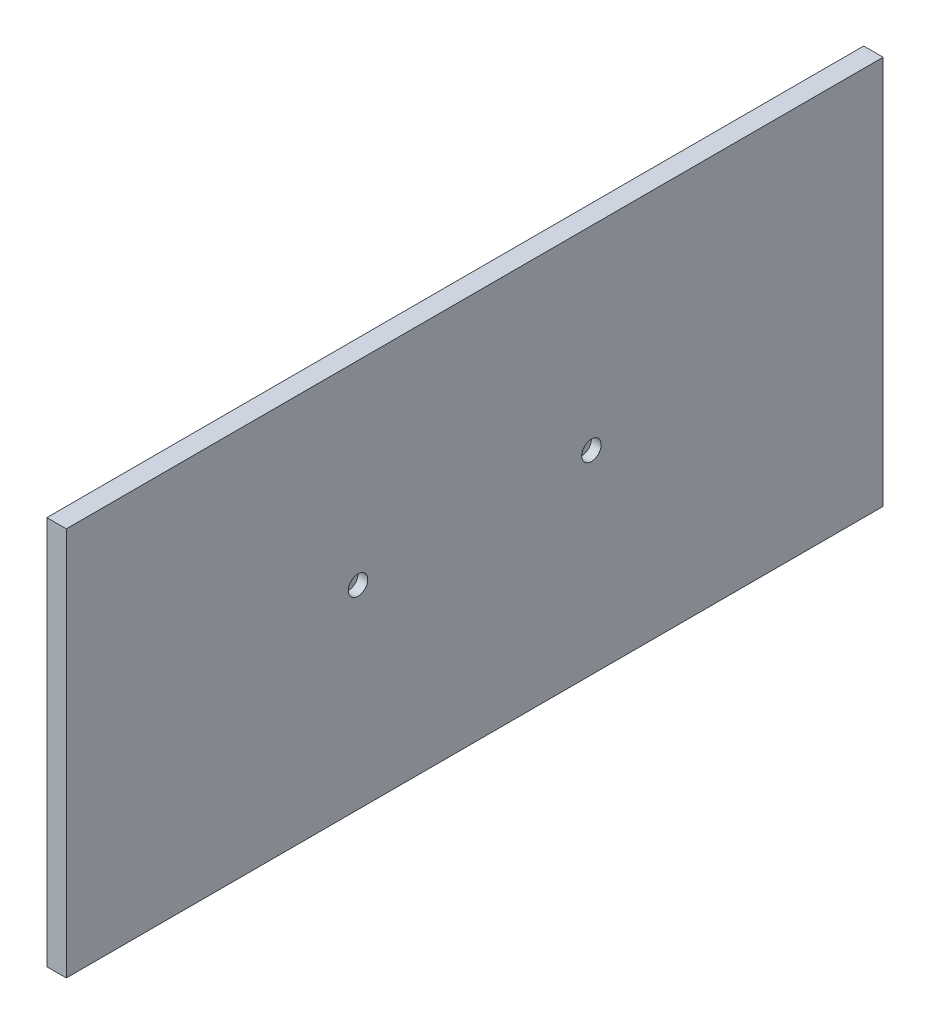
ISO-10303-21;
HEADER;
FILE_DESCRIPTION(('STEP AP214'),'2;1');
FILE_NAME('part.step','',(''),(''),'','','');
FILE_SCHEMA(('AUTOMOTIVE_DESIGN { 1 0 10303 214 1 1 1 1 }'));
ENDSEC;
DATA;
#1=APPLICATION_CONTEXT('core data for automotive mechanical design processes');
#2=APPLICATION_PROTOCOL_DEFINITION('international standard','automotive_design',2000,#1);
#3=PRODUCT_CONTEXT('',#1,'mechanical');
#4=PRODUCT('Part','Part','',(#3));
#5=PRODUCT_RELATED_PRODUCT_CATEGORY('part','',(#4));
#6=PRODUCT_DEFINITION_FORMATION('','',#4);
#7=PRODUCT_DEFINITION_CONTEXT('part definition',#1,'design');
#8=PRODUCT_DEFINITION('design','',#6,#7);
#9=PRODUCT_DEFINITION_SHAPE('','',#8);
#10=(LENGTH_UNIT() NAMED_UNIT(*) SI_UNIT(.MILLI.,.METRE.));
#11=(NAMED_UNIT(*) PLANE_ANGLE_UNIT() SI_UNIT($,.RADIAN.));
#12=(NAMED_UNIT(*) SI_UNIT($,.STERADIAN.) SOLID_ANGLE_UNIT());
#13=UNCERTAINTY_MEASURE_WITH_UNIT(LENGTH_MEASURE(1.E-05),#10,'distance_accuracy_value','');
#14=(GEOMETRIC_REPRESENTATION_CONTEXT(3) GLOBAL_UNCERTAINTY_ASSIGNED_CONTEXT((#13)) GLOBAL_UNIT_ASSIGNED_CONTEXT((#10,
#11,#12)) REPRESENTATION_CONTEXT('',''));
#15=CARTESIAN_POINT('',(0.,0.,0.));
#16=DIRECTION('',(0.,0.,1.));
#17=DIRECTION('',(1.,0.,0.));
#18=AXIS2_PLACEMENT_3D('',#15,#16,#17);
#19=CARTESIAN_POINT('',(10.,0.,0.));
#20=DIRECTION('',(0.,0.,-1.));
#21=DIRECTION('',(-1.,0.,0.));
#22=AXIS2_PLACEMENT_3D('',#19,#20,#21);
#23=PLANE('',#22);
#24=DIRECTION('',(0.,-1.,0.));
#25=VECTOR('',#24,1.);
#26=CARTESIAN_POINT('',(0.,0.,0.));
#27=LINE('',#26,#25);
#28=CARTESIAN_POINT('',(0.,200.,0.));
#29=VERTEX_POINT('',#28);
#30=CARTESIAN_POINT('',(0.,0.,0.));
#31=VERTEX_POINT('',#30);
#32=EDGE_CURVE('E98',#29,#31,#27,.T.);
#33=ORIENTED_EDGE('',*,*,#32,.T.);
#34=DIRECTION('',(-1.,0.,0.));
#35=VECTOR('',#34,1.);
#36=CARTESIAN_POINT('',(10.,0.,0.));
#37=LINE('',#36,#35);
#38=CARTESIAN_POINT('',(10.,0.,0.));
#39=VERTEX_POINT('',#38);
#40=EDGE_CURVE('E11',#39,#31,#37,.T.);
#41=ORIENTED_EDGE('',*,*,#40,.F.);
#42=DIRECTION('',(0.,-1.,0.));
#43=VECTOR('',#42,1.);
#44=CARTESIAN_POINT('',(10.,0.,0.));
#45=LINE('',#44,#43);
#46=CARTESIAN_POINT('',(10.,200.,0.));
#47=VERTEX_POINT('',#46);
#48=EDGE_CURVE('E86',#47,#39,#45,.T.);
#49=ORIENTED_EDGE('',*,*,#48,.F.);
#50=DIRECTION('',(-1.,0.,0.));
#51=VECTOR('',#50,1.);
#52=CARTESIAN_POINT('',(10.,200.,0.));
#53=LINE('',#52,#51);
#54=EDGE_CURVE('E94',#47,#29,#53,.T.);
#55=ORIENTED_EDGE('',*,*,#54,.T.);
#56=EDGE_LOOP('',(#33,#41,#49,#55));
#57=FACE_BOUND('',#56,.T.);
#58=ADVANCED_FACE('F35',(#57),#23,.F.);
#59=CARTESIAN_POINT('',(10.,0.,0.));
#60=DIRECTION('',(0.,1.,0.));
#61=DIRECTION('',(0.,0.,1.));
#62=AXIS2_PLACEMENT_3D('',#59,#60,#61);
#63=PLANE('',#62);
#64=DIRECTION('',(0.,0.,-1.));
#65=VECTOR('',#64,1.);
#66=CARTESIAN_POINT('',(0.,0.,0.));
#67=LINE('',#66,#65);
#68=CARTESIAN_POINT('',(0.,0.,-420.));
#69=VERTEX_POINT('',#68);
#70=EDGE_CURVE('E90',#31,#69,#67,.T.);
#71=ORIENTED_EDGE('',*,*,#70,.T.);
#72=DIRECTION('',(-1.,0.,0.));
#73=VECTOR('',#72,1.);
#74=CARTESIAN_POINT('',(10.,0.,-420.));
#75=LINE('',#74,#73);
#76=CARTESIAN_POINT('',(10.,0.,-420.));
#77=VERTEX_POINT('',#76);
#78=EDGE_CURVE('E43',#77,#69,#75,.T.);
#79=ORIENTED_EDGE('',*,*,#78,.F.);
#80=DIRECTION('',(0.,0.,-1.));
#81=VECTOR('',#80,1.);
#82=CARTESIAN_POINT('',(10.,0.,0.));
#83=LINE('',#82,#81);
#84=EDGE_CURVE('E81',#39,#77,#83,.T.);
#85=ORIENTED_EDGE('',*,*,#84,.F.);
#86=ORIENTED_EDGE('',*,*,#40,.T.);
#87=EDGE_LOOP('',(#71,#79,#85,#86));
#88=FACE_BOUND('',#87,.T.);
#89=ADVANCED_FACE('F89',(#88),#63,.F.);
#90=CARTESIAN_POINT('',(10.,0.,-420.));
#91=DIRECTION('',(0.,0.,1.));
#92=DIRECTION('',(1.,0.,0.));
#93=AXIS2_PLACEMENT_3D('',#90,#91,#92);
#94=PLANE('',#93);
#95=DIRECTION('',(0.,1.,0.));
#96=VECTOR('',#95,1.);
#97=CARTESIAN_POINT('',(0.,0.,-420.));
#98=LINE('',#97,#96);
#99=CARTESIAN_POINT('',(0.,200.,-420.));
#100=VERTEX_POINT('',#99);
#101=EDGE_CURVE('E68',#69,#100,#98,.T.);
#102=ORIENTED_EDGE('',*,*,#101,.T.);
#103=DIRECTION('',(-1.,0.,0.));
#104=VECTOR('',#103,1.);
#105=CARTESIAN_POINT('',(10.,200.,-420.));
#106=LINE('',#105,#104);
#107=CARTESIAN_POINT('',(10.,200.,-420.));
#108=VERTEX_POINT('',#107);
#109=EDGE_CURVE('E91',#108,#100,#106,.T.);
#110=ORIENTED_EDGE('',*,*,#109,.F.);
#111=DIRECTION('',(0.,1.,0.));
#112=VECTOR('',#111,1.);
#113=CARTESIAN_POINT('',(10.,0.,-420.));
#114=LINE('',#113,#112);
#115=EDGE_CURVE('E84',#77,#108,#114,.T.);
#116=ORIENTED_EDGE('',*,*,#115,.F.);
#117=ORIENTED_EDGE('',*,*,#78,.T.);
#118=EDGE_LOOP('',(#102,#110,#116,#117));
#119=FACE_BOUND('',#118,.T.);
#120=ADVANCED_FACE('F92',(#119),#94,.F.);
#121=CARTESIAN_POINT('',(10.,200.,0.));
#122=DIRECTION('',(0.,-1.,0.));
#123=DIRECTION('',(0.,0.,-1.));
#124=AXIS2_PLACEMENT_3D('',#121,#122,#123);
#125=PLANE('',#124);
#126=DIRECTION('',(0.,0.,1.));
#127=VECTOR('',#126,1.);
#128=CARTESIAN_POINT('',(0.,200.,0.));
#129=LINE('',#128,#127);
#130=EDGE_CURVE('E74',#100,#29,#129,.T.);
#131=ORIENTED_EDGE('',*,*,#130,.T.);
#132=ORIENTED_EDGE('',*,*,#54,.F.);
#133=DIRECTION('',(0.,0.,1.));
#134=VECTOR('',#133,1.);
#135=CARTESIAN_POINT('',(10.,200.,0.));
#136=LINE('',#135,#134);
#137=EDGE_CURVE('E51',#108,#47,#136,.T.);
#138=ORIENTED_EDGE('',*,*,#137,.F.);
#139=ORIENTED_EDGE('',*,*,#109,.T.);
#140=EDGE_LOOP('',(#131,#132,#138,#139));
#141=FACE_BOUND('',#140,.T.);
#142=ADVANCED_FACE('F106',(#141),#125,.F.);
#143=CARTESIAN_POINT('',(10.,0.,0.));
#144=DIRECTION('',(-1.,0.,0.));
#145=DIRECTION('',(0.,0.,1.));
#146=AXIS2_PLACEMENT_3D('',#143,#144,#145);
#147=PLANE('',#146);
#148=CARTESIAN_POINT('',(10.,100.,-270.));
#149=DIRECTION('',(1.,0.,0.));
#150=DIRECTION('',(0.,0.,-1.));
#151=AXIS2_PLACEMENT_3D('',#148,#149,#150);
#152=CIRCLE('',#151,4.99999999999999);
#153=CARTESIAN_POINT('',(10.,100.,-275.));
#154=VERTEX_POINT('',#153);
#155=EDGE_CURVE('E118',#154,#154,#152,.T.);
#156=ORIENTED_EDGE('',*,*,#155,.F.);
#157=EDGE_LOOP('',(#156));
#158=FACE_BOUND('',#157,.T.);
#159=CARTESIAN_POINT('',(10.,100.,-150.));
#160=DIRECTION('',(1.,0.,0.));
#161=DIRECTION('',(0.,0.,-1.));
#162=AXIS2_PLACEMENT_3D('',#159,#160,#161);
#163=CIRCLE('',#162,5.00000000000002);
#164=CARTESIAN_POINT('',(10.,100.,-155.));
#165=VERTEX_POINT('',#164);
#166=EDGE_CURVE('E112',#165,#165,#163,.T.);
#167=ORIENTED_EDGE('',*,*,#166,.F.);
#168=EDGE_LOOP('',(#167));
#169=FACE_BOUND('',#168,.T.);
#170=ORIENTED_EDGE('',*,*,#48,.T.);
#171=ORIENTED_EDGE('',*,*,#84,.T.);
#172=ORIENTED_EDGE('',*,*,#115,.T.);
#173=ORIENTED_EDGE('',*,*,#137,.T.);
#174=EDGE_LOOP('',(#170,#171,#172,#173));
#175=FACE_BOUND('',#174,.T.);
#176=ADVANCED_FACE('F82',(#158,#169,#175),#147,.F.);
#177=CARTESIAN_POINT('',(0.,0.,0.));
#178=DIRECTION('',(-1.,0.,0.));
#179=DIRECTION('',(0.,0.,1.));
#180=AXIS2_PLACEMENT_3D('',#177,#178,#179);
#181=PLANE('',#180);
#182=ORIENTED_EDGE('',*,*,#32,.F.);
#183=ORIENTED_EDGE('',*,*,#130,.F.);
#184=ORIENTED_EDGE('',*,*,#101,.F.);
#185=ORIENTED_EDGE('',*,*,#70,.F.);
#186=EDGE_LOOP('',(#182,#183,#184,#185));
#187=FACE_BOUND('',#186,.T.);
#188=ADVANCED_FACE('F109',(#187),#181,.T.);
#189=CARTESIAN_POINT('',(5.,100.,-150.));
#190=DIRECTION('',(1.,0.,0.));
#191=DIRECTION('',(0.,0.,-1.));
#192=AXIS2_PLACEMENT_3D('',#189,#190,#191);
#193=CYLINDRICAL_SURFACE('',#192,5.00000000000002);
#194=CARTESIAN_POINT('',(5.,100.,-150.));
#195=DIRECTION('',(1.,0.,0.));
#196=DIRECTION('',(0.,0.,-1.));
#197=AXIS2_PLACEMENT_3D('',#194,#195,#196);
#198=CIRCLE('',#197,5.00000000000002);
#199=CARTESIAN_POINT('',(5.,100.,-155.));
#200=VERTEX_POINT('',#199);
#201=EDGE_CURVE('E101',#200,#200,#198,.T.);
#202=ORIENTED_EDGE('',*,*,#201,.F.);
#203=EDGE_LOOP('',(#202));
#204=FACE_BOUND('',#203,.T.);
#205=ORIENTED_EDGE('',*,*,#166,.T.);
#206=EDGE_LOOP('',(#205));
#207=FACE_BOUND('',#206,.T.);
#208=ADVANCED_FACE('F138',(#204,#207),#193,.F.);
#209=CARTESIAN_POINT('',(5.,100.,-150.));
#210=DIRECTION('',(1.,0.,0.));
#211=DIRECTION('',(0.,0.,-1.));
#212=AXIS2_PLACEMENT_3D('',#209,#210,#211);
#213=PLANE('',#212);
#214=ORIENTED_EDGE('',*,*,#201,.T.);
#215=EDGE_LOOP('',(#214));
#216=FACE_BOUND('',#215,.T.);
#217=ADVANCED_FACE('F129',(#216),#213,.T.);
#218=CARTESIAN_POINT('',(5.,100.,-270.));
#219=DIRECTION('',(1.,0.,0.));
#220=DIRECTION('',(0.,0.,-1.));
#221=AXIS2_PLACEMENT_3D('',#218,#219,#220);
#222=CYLINDRICAL_SURFACE('',#221,4.99999999999999);
#223=CARTESIAN_POINT('',(5.,100.,-270.));
#224=DIRECTION('',(1.,0.,0.));
#225=DIRECTION('',(0.,0.,-1.));
#226=AXIS2_PLACEMENT_3D('',#223,#224,#225);
#227=CIRCLE('',#226,4.99999999999999);
#228=CARTESIAN_POINT('',(5.,100.,-275.));
#229=VERTEX_POINT('',#228);
#230=EDGE_CURVE('E115',#229,#229,#227,.T.);
#231=ORIENTED_EDGE('',*,*,#230,.F.);
#232=EDGE_LOOP('',(#231));
#233=FACE_BOUND('',#232,.T.);
#234=ORIENTED_EDGE('',*,*,#155,.T.);
#235=EDGE_LOOP('',(#234));
#236=FACE_BOUND('',#235,.T.);
#237=ADVANCED_FACE('F126',(#233,#236),#222,.F.);
#238=CARTESIAN_POINT('',(5.,100.,-270.));
#239=DIRECTION('',(1.,0.,0.));
#240=DIRECTION('',(0.,0.,-1.));
#241=AXIS2_PLACEMENT_3D('',#238,#239,#240);
#242=PLANE('',#241);
#243=ORIENTED_EDGE('',*,*,#230,.T.);
#244=EDGE_LOOP('',(#243));
#245=FACE_BOUND('',#244,.T.);
#246=ADVANCED_FACE('F124',(#245),#242,.T.);
#247=CLOSED_SHELL('',(#58,#89,#120,#142,#176,#188,#208,#217,#237,#246));
#248=MANIFOLD_SOLID_BREP('B2',#247);
#249=ADVANCED_BREP_SHAPE_REPRESENTATION('',(#18,#248),#14);
#250=SHAPE_DEFINITION_REPRESENTATION(#9,#249);
ENDSEC;
END-ISO-10303-21;
